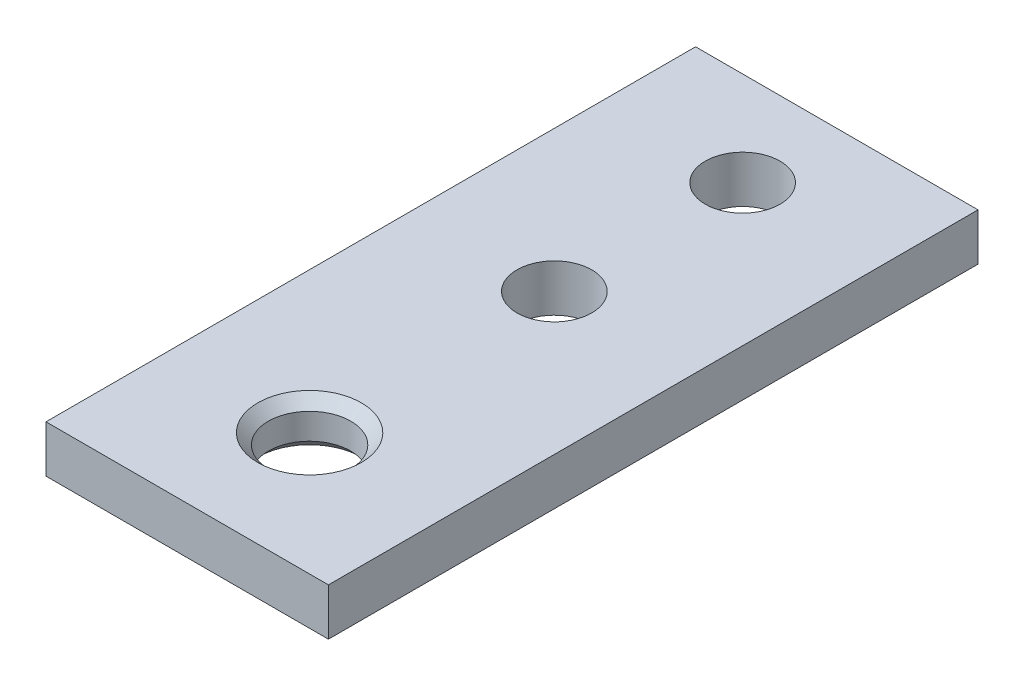
ISO-10303-21;
HEADER;
FILE_DESCRIPTION(('STEP AP214'),'2;1');
FILE_NAME('part.step','',(''),(''),'','','');
FILE_SCHEMA(('AUTOMOTIVE_DESIGN { 1 0 10303 214 1 1 1 1 }'));
ENDSEC;
DATA;
#1=APPLICATION_CONTEXT('core data for automotive mechanical design processes');
#2=APPLICATION_PROTOCOL_DEFINITION('international standard','automotive_design',2000,#1);
#3=PRODUCT_CONTEXT('',#1,'mechanical');
#4=PRODUCT('Part','Part','',(#3));
#5=PRODUCT_RELATED_PRODUCT_CATEGORY('part','',(#4));
#6=PRODUCT_DEFINITION_FORMATION('','',#4);
#7=PRODUCT_DEFINITION_CONTEXT('part definition',#1,'design');
#8=PRODUCT_DEFINITION('design','',#6,#7);
#9=PRODUCT_DEFINITION_SHAPE('','',#8);
#10=(LENGTH_UNIT() NAMED_UNIT(*) SI_UNIT(.MILLI.,.METRE.));
#11=(NAMED_UNIT(*) PLANE_ANGLE_UNIT() SI_UNIT($,.RADIAN.));
#12=(NAMED_UNIT(*) SI_UNIT($,.STERADIAN.) SOLID_ANGLE_UNIT());
#13=UNCERTAINTY_MEASURE_WITH_UNIT(LENGTH_MEASURE(1.E-05),#10,'distance_accuracy_value','');
#14=(GEOMETRIC_REPRESENTATION_CONTEXT(3) GLOBAL_UNCERTAINTY_ASSIGNED_CONTEXT((#13)) GLOBAL_UNIT_ASSIGNED_CONTEXT((#10,
#11,#12)) REPRESENTATION_CONTEXT('',''));
#15=CARTESIAN_POINT('',(0.,0.,0.));
#16=DIRECTION('',(0.,0.,1.));
#17=DIRECTION('',(1.,0.,0.));
#18=AXIS2_PLACEMENT_3D('',#15,#16,#17);
#19=CARTESIAN_POINT('',(19.05,-3.175,87.63));
#20=DIRECTION('',(-1.,0.,0.));
#21=DIRECTION('',(0.,0.,1.));
#22=AXIS2_PLACEMENT_3D('',#19,#20,#21);
#23=PLANE('',#22);
#24=DIRECTION('',(0.,1.,0.));
#25=VECTOR('',#24,1.);
#26=CARTESIAN_POINT('',(19.05,-3.175,0.));
#27=LINE('',#26,#25);
#28=CARTESIAN_POINT('',(19.05,-3.175,0.));
#29=VERTEX_POINT('',#28);
#30=CARTESIAN_POINT('',(19.05,3.175,0.));
#31=VERTEX_POINT('',#30);
#32=EDGE_CURVE('E104',#29,#31,#27,.T.);
#33=ORIENTED_EDGE('',*,*,#32,.T.);
#34=DIRECTION('',(0.,0.,-1.));
#35=VECTOR('',#34,1.);
#36=CARTESIAN_POINT('',(19.05,3.175,87.63));
#37=LINE('',#36,#35);
#38=CARTESIAN_POINT('',(19.05,3.175,87.63));
#39=VERTEX_POINT('',#38);
#40=EDGE_CURVE('E11',#39,#31,#37,.T.);
#41=ORIENTED_EDGE('',*,*,#40,.F.);
#42=DIRECTION('',(0.,1.,0.));
#43=VECTOR('',#42,1.);
#44=CARTESIAN_POINT('',(19.05,-3.175,87.63));
#45=LINE('',#44,#43);
#46=CARTESIAN_POINT('',(19.05,-3.175,87.63));
#47=VERTEX_POINT('',#46);
#48=EDGE_CURVE('E91',#47,#39,#45,.T.);
#49=ORIENTED_EDGE('',*,*,#48,.F.);
#50=DIRECTION('',(0.,0.,-1.));
#51=VECTOR('',#50,1.);
#52=CARTESIAN_POINT('',(19.05,-3.175,87.63));
#53=LINE('',#52,#51);
#54=EDGE_CURVE('E100',#47,#29,#53,.T.);
#55=ORIENTED_EDGE('',*,*,#54,.T.);
#56=EDGE_LOOP('',(#33,#41,#49,#55));
#57=FACE_BOUND('',#56,.T.);
#58=ADVANCED_FACE('F39',(#57),#23,.F.);
#59=CARTESIAN_POINT('',(-19.05,3.175,87.63));
#60=DIRECTION('',(0.,-1.,0.));
#61=DIRECTION('',(0.,0.,-1.));
#62=AXIS2_PLACEMENT_3D('',#59,#60,#61);
#63=PLANE('',#62);
#64=CARTESIAN_POINT('',(0.,3.175,71.12));
#65=DIRECTION('',(0.,1.,0.));
#66=DIRECTION('',(0.,0.,1.));
#67=AXIS2_PLACEMENT_3D('',#64,#65,#66);
#68=CIRCLE('',#67,6.985);
#69=CARTESIAN_POINT('',(0.,3.175,78.105));
#70=VERTEX_POINT('',#69);
#71=EDGE_CURVE('E135',#70,#70,#68,.T.);
#72=ORIENTED_EDGE('',*,*,#71,.F.);
#73=EDGE_LOOP('',(#72));
#74=FACE_BOUND('',#73,.T.);
#75=CARTESIAN_POINT('',(0.,3.175,12.7));
#76=DIRECTION('',(0.,1.,0.));
#77=DIRECTION('',(0.,0.,1.));
#78=AXIS2_PLACEMENT_3D('',#75,#76,#77);
#79=CIRCLE('',#78,5.0419);
#80=CARTESIAN_POINT('',(0.,3.175,17.7419));
#81=VERTEX_POINT('',#80);
#82=EDGE_CURVE('E123',#81,#81,#79,.T.);
#83=ORIENTED_EDGE('',*,*,#82,.F.);
#84=EDGE_LOOP('',(#83));
#85=FACE_BOUND('',#84,.T.);
#86=CARTESIAN_POINT('',(0.,3.175,38.1));
#87=DIRECTION('',(0.,1.,0.));
#88=DIRECTION('',(0.,0.,1.));
#89=AXIS2_PLACEMENT_3D('',#86,#87,#88);
#90=CIRCLE('',#89,5.0419);
#91=CARTESIAN_POINT('',(0.,3.175,43.1419));
#92=VERTEX_POINT('',#91);
#93=EDGE_CURVE('E120',#92,#92,#90,.T.);
#94=ORIENTED_EDGE('',*,*,#93,.F.);
#95=EDGE_LOOP('',(#94));
#96=FACE_BOUND('',#95,.T.);
#97=DIRECTION('',(-1.,0.,0.));
#98=VECTOR('',#97,1.);
#99=CARTESIAN_POINT('',(-19.05,3.175,0.));
#100=LINE('',#99,#98);
#101=CARTESIAN_POINT('',(-19.05,3.175,0.));
#102=VERTEX_POINT('',#101);
#103=EDGE_CURVE('E95',#31,#102,#100,.T.);
#104=ORIENTED_EDGE('',*,*,#103,.T.);
#105=DIRECTION('',(0.,0.,-1.));
#106=VECTOR('',#105,1.);
#107=CARTESIAN_POINT('',(-19.05,3.175,87.63));
#108=LINE('',#107,#106);
#109=CARTESIAN_POINT('',(-19.05,3.175,87.63));
#110=VERTEX_POINT('',#109);
#111=EDGE_CURVE('E48',#110,#102,#108,.T.);
#112=ORIENTED_EDGE('',*,*,#111,.F.);
#113=DIRECTION('',(-1.,0.,0.));
#114=VECTOR('',#113,1.);
#115=CARTESIAN_POINT('',(-19.05,3.175,87.63));
#116=LINE('',#115,#114);
#117=EDGE_CURVE('E86',#39,#110,#116,.T.);
#118=ORIENTED_EDGE('',*,*,#117,.F.);
#119=ORIENTED_EDGE('',*,*,#40,.T.);
#120=EDGE_LOOP('',(#104,#112,#118,#119));
#121=FACE_BOUND('',#120,.T.);
#122=ADVANCED_FACE('F94',(#74,#85,#96,#121),#63,.F.);
#123=CARTESIAN_POINT('',(-19.05,-3.175,87.63));
#124=DIRECTION('',(1.,0.,0.));
#125=DIRECTION('',(0.,0.,-1.));
#126=AXIS2_PLACEMENT_3D('',#123,#124,#125);
#127=PLANE('',#126);
#128=DIRECTION('',(0.,-1.,0.));
#129=VECTOR('',#128,1.);
#130=CARTESIAN_POINT('',(-19.05,-3.175,0.));
#131=LINE('',#130,#129);
#132=CARTESIAN_POINT('',(-19.05,-3.175,0.));
#133=VERTEX_POINT('',#132);
#134=EDGE_CURVE('E73',#102,#133,#131,.T.);
#135=ORIENTED_EDGE('',*,*,#134,.T.);
#136=DIRECTION('',(0.,0.,-1.));
#137=VECTOR('',#136,1.);
#138=CARTESIAN_POINT('',(-19.05,-3.175,87.63));
#139=LINE('',#138,#137);
#140=CARTESIAN_POINT('',(-19.05,-3.175,87.63));
#141=VERTEX_POINT('',#140);
#142=EDGE_CURVE('E96',#141,#133,#139,.T.);
#143=ORIENTED_EDGE('',*,*,#142,.F.);
#144=DIRECTION('',(0.,-1.,0.));
#145=VECTOR('',#144,1.);
#146=CARTESIAN_POINT('',(-19.05,-3.175,87.63));
#147=LINE('',#146,#145);
#148=EDGE_CURVE('E89',#110,#141,#147,.T.);
#149=ORIENTED_EDGE('',*,*,#148,.F.);
#150=ORIENTED_EDGE('',*,*,#111,.T.);
#151=EDGE_LOOP('',(#135,#143,#149,#150));
#152=FACE_BOUND('',#151,.T.);
#153=ADVANCED_FACE('F98',(#152),#127,.F.);
#154=CARTESIAN_POINT('',(-19.05,-3.175,87.63));
#155=DIRECTION('',(0.,1.,0.));
#156=DIRECTION('',(0.,0.,1.));
#157=AXIS2_PLACEMENT_3D('',#154,#155,#156);
#158=PLANE('',#157);
#159=CARTESIAN_POINT('',(0.,-3.175,71.12));
#160=DIRECTION('',(0.,1.,0.));
#161=DIRECTION('',(0.,0.,1.));
#162=AXIS2_PLACEMENT_3D('',#159,#160,#161);
#163=CIRCLE('',#162,6.985);
#164=CARTESIAN_POINT('',(0.,-3.175,78.105));
#165=VERTEX_POINT('',#164);
#166=EDGE_CURVE('E126',#165,#165,#163,.T.);
#167=ORIENTED_EDGE('',*,*,#166,.T.);
#168=EDGE_LOOP('',(#167));
#169=FACE_BOUND('',#168,.T.);
#170=CARTESIAN_POINT('',(0.,-3.175,12.7));
#171=DIRECTION('',(0.,1.,0.));
#172=DIRECTION('',(0.,0.,1.));
#173=AXIS2_PLACEMENT_3D('',#170,#171,#172);
#174=CIRCLE('',#173,5.0419);
#175=CARTESIAN_POINT('',(0.,-3.175,17.7419));
#176=VERTEX_POINT('',#175);
#177=EDGE_CURVE('E42',#176,#176,#174,.T.);
#178=ORIENTED_EDGE('',*,*,#177,.T.);
#179=EDGE_LOOP('',(#178));
#180=FACE_BOUND('',#179,.T.);
#181=CARTESIAN_POINT('',(0.,-3.175,38.1));
#182=DIRECTION('',(0.,1.,0.));
#183=DIRECTION('',(0.,0.,1.));
#184=AXIS2_PLACEMENT_3D('',#181,#182,#183);
#185=CIRCLE('',#184,5.0419);
#186=CARTESIAN_POINT('',(0.,-3.175,43.1419));
#187=VERTEX_POINT('',#186);
#188=EDGE_CURVE('E107',#187,#187,#185,.T.);
#189=ORIENTED_EDGE('',*,*,#188,.T.);
#190=EDGE_LOOP('',(#189));
#191=FACE_BOUND('',#190,.T.);
#192=DIRECTION('',(1.,0.,0.));
#193=VECTOR('',#192,1.);
#194=CARTESIAN_POINT('',(-19.05,-3.175,0.));
#195=LINE('',#194,#193);
#196=EDGE_CURVE('E79',#133,#29,#195,.T.);
#197=ORIENTED_EDGE('',*,*,#196,.T.);
#198=ORIENTED_EDGE('',*,*,#54,.F.);
#199=DIRECTION('',(1.,0.,0.));
#200=VECTOR('',#199,1.);
#201=CARTESIAN_POINT('',(-19.05,-3.175,87.63));
#202=LINE('',#201,#200);
#203=EDGE_CURVE('E56',#141,#47,#202,.T.);
#204=ORIENTED_EDGE('',*,*,#203,.F.);
#205=ORIENTED_EDGE('',*,*,#142,.T.);
#206=EDGE_LOOP('',(#197,#198,#204,#205));
#207=FACE_BOUND('',#206,.T.);
#208=ADVANCED_FACE('F112',(#169,#180,#191,#207),#158,.F.);
#209=CARTESIAN_POINT('',(19.05,3.175,87.63));
#210=DIRECTION('',(0.,0.,-1.));
#211=DIRECTION('',(-1.,0.,0.));
#212=AXIS2_PLACEMENT_3D('',#209,#210,#211);
#213=PLANE('',#212);
#214=ORIENTED_EDGE('',*,*,#48,.T.);
#215=ORIENTED_EDGE('',*,*,#117,.T.);
#216=ORIENTED_EDGE('',*,*,#148,.T.);
#217=ORIENTED_EDGE('',*,*,#203,.T.);
#218=EDGE_LOOP('',(#214,#215,#216,#217));
#219=FACE_BOUND('',#218,.T.);
#220=ADVANCED_FACE('F87',(#219),#213,.F.);
#221=CARTESIAN_POINT('',(19.05,3.175,0.));
#222=DIRECTION('',(0.,0.,-1.));
#223=DIRECTION('',(-1.,0.,0.));
#224=AXIS2_PLACEMENT_3D('',#221,#222,#223);
#225=PLANE('',#224);
#226=ORIENTED_EDGE('',*,*,#32,.F.);
#227=ORIENTED_EDGE('',*,*,#196,.F.);
#228=ORIENTED_EDGE('',*,*,#134,.F.);
#229=ORIENTED_EDGE('',*,*,#103,.F.);
#230=EDGE_LOOP('',(#226,#227,#228,#229));
#231=FACE_BOUND('',#230,.T.);
#232=ADVANCED_FACE('F115',(#231),#225,.T.);
#233=CARTESIAN_POINT('',(0.,3.175,38.1));
#234=DIRECTION('',(0.,1.,0.));
#235=DIRECTION('',(0.,0.,1.));
#236=AXIS2_PLACEMENT_3D('',#233,#234,#235);
#237=CYLINDRICAL_SURFACE('',#236,5.0419);
#238=ORIENTED_EDGE('',*,*,#93,.T.);
#239=EDGE_LOOP('',(#238));
#240=FACE_BOUND('',#239,.T.);
#241=ORIENTED_EDGE('',*,*,#188,.F.);
#242=EDGE_LOOP('',(#241));
#243=FACE_BOUND('',#242,.T.);
#244=ADVANCED_FACE('F147',(#240,#243),#237,.F.);
#245=CARTESIAN_POINT('',(0.,3.175,12.7));
#246=DIRECTION('',(0.,1.,0.));
#247=DIRECTION('',(0.,0.,1.));
#248=AXIS2_PLACEMENT_3D('',#245,#246,#247);
#249=CYLINDRICAL_SURFACE('',#248,5.0419);
#250=ORIENTED_EDGE('',*,*,#82,.T.);
#251=EDGE_LOOP('',(#250));
#252=FACE_BOUND('',#251,.T.);
#253=ORIENTED_EDGE('',*,*,#177,.F.);
#254=EDGE_LOOP('',(#253));
#255=FACE_BOUND('',#254,.T.);
#256=ADVANCED_FACE('F150',(#252,#255),#249,.F.);
#257=CARTESIAN_POINT('',(0.,-1.74625,71.12));
#258=DIRECTION('',(0.,-1.,0.));
#259=DIRECTION('',(0.,0.,-1.));
#260=AXIS2_PLACEMENT_3D('',#257,#258,#259);
#261=CONICAL_SURFACE('',#260,5.55625,0.785398163397447);
#262=ORIENTED_EDGE('',*,*,#166,.F.);
#263=EDGE_LOOP('',(#262));
#264=FACE_BOUND('',#263,.T.);
#265=CARTESIAN_POINT('',(0.,-1.74625,71.12));
#266=DIRECTION('',(0.,1.,0.));
#267=DIRECTION('',(0.,0.,1.));
#268=AXIS2_PLACEMENT_3D('',#265,#266,#267);
#269=CIRCLE('',#268,5.55625);
#270=CARTESIAN_POINT('',(0.,-1.74625,76.67625));
#271=VERTEX_POINT('',#270);
#272=EDGE_CURVE('E129',#271,#271,#269,.T.);
#273=ORIENTED_EDGE('',*,*,#272,.T.);
#274=EDGE_LOOP('',(#273));
#275=FACE_BOUND('',#274,.T.);
#276=ADVANCED_FACE('F204',(#264,#275),#261,.F.);
#277=CARTESIAN_POINT('',(0.,3.175,71.12));
#278=DIRECTION('',(0.,1.,0.));
#279=DIRECTION('',(0.,0.,1.));
#280=AXIS2_PLACEMENT_3D('',#277,#278,#279);
#281=CYLINDRICAL_SURFACE('',#280,5.55625);
#282=ORIENTED_EDGE('',*,*,#272,.F.);
#283=EDGE_LOOP('',(#282));
#284=FACE_BOUND('',#283,.T.);
#285=CARTESIAN_POINT('',(0.,1.74625,71.12));
#286=DIRECTION('',(0.,1.,0.));
#287=DIRECTION('',(0.,0.,1.));
#288=AXIS2_PLACEMENT_3D('',#285,#286,#287);
#289=CIRCLE('',#288,5.55625);
#290=CARTESIAN_POINT('',(0.,1.74625,76.67625));
#291=VERTEX_POINT('',#290);
#292=EDGE_CURVE('E132',#291,#291,#289,.T.);
#293=ORIENTED_EDGE('',*,*,#292,.T.);
#294=EDGE_LOOP('',(#293));
#295=FACE_BOUND('',#294,.T.);
#296=ADVANCED_FACE('F215',(#284,#295),#281,.F.);
#297=CARTESIAN_POINT('',(0.,3.175,71.12));
#298=DIRECTION('',(0.,1.,0.));
#299=DIRECTION('',(0.,0.,1.));
#300=AXIS2_PLACEMENT_3D('',#297,#298,#299);
#301=CONICAL_SURFACE('',#300,6.985,0.785398163397449);
#302=ORIENTED_EDGE('',*,*,#292,.F.);
#303=EDGE_LOOP('',(#302));
#304=FACE_BOUND('',#303,.T.);
#305=ORIENTED_EDGE('',*,*,#71,.T.);
#306=EDGE_LOOP('',(#305));
#307=FACE_BOUND('',#306,.T.);
#308=ADVANCED_FACE('F139',(#304,#307),#301,.F.);
#309=CLOSED_SHELL('',(#58,#122,#153,#208,#220,#232,#244,#256,#276,#296,#308));
#310=MANIFOLD_SOLID_BREP('B2',#309);
#311=ADVANCED_BREP_SHAPE_REPRESENTATION('',(#18,#310),#14);
#312=SHAPE_DEFINITION_REPRESENTATION(#9,#311);
ENDSEC;
END-ISO-10303-21;
